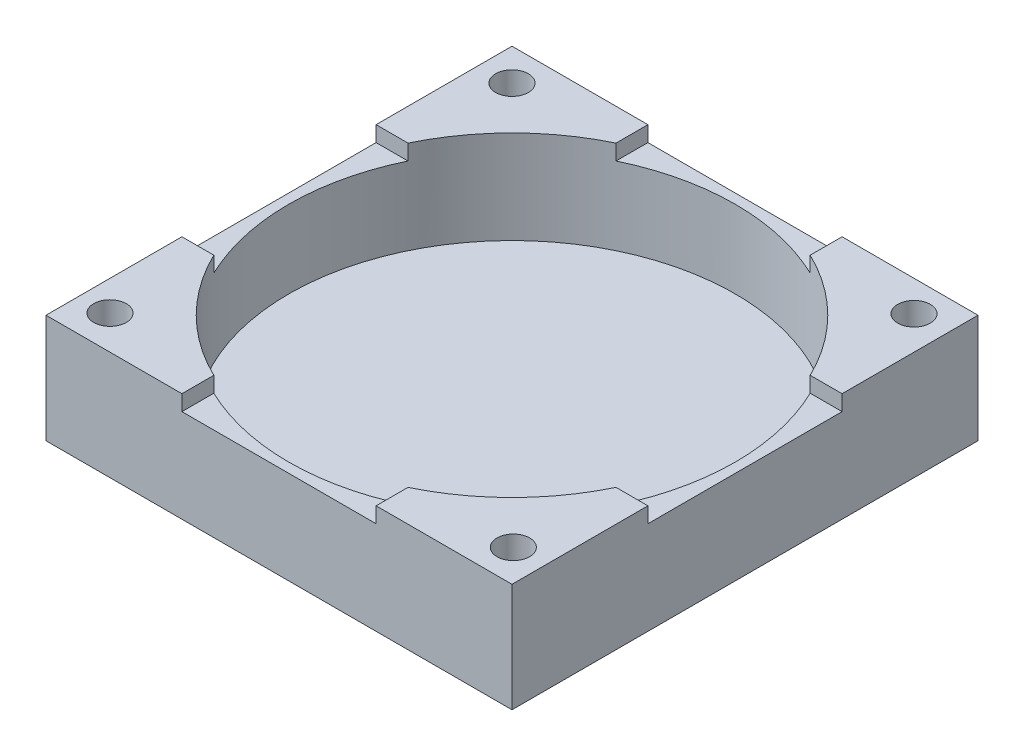
ISO-10303-21;
HEADER;
FILE_DESCRIPTION(('STEP AP214'),'2;1');
FILE_NAME('part.step','',(''),(''),'','','');
FILE_SCHEMA(('AUTOMOTIVE_DESIGN { 1 0 10303 214 1 1 1 1 }'));
ENDSEC;
DATA;
#1=APPLICATION_CONTEXT('core data for automotive mechanical design processes');
#2=APPLICATION_PROTOCOL_DEFINITION('international standard','automotive_design',2000,#1);
#3=PRODUCT_CONTEXT('',#1,'mechanical');
#4=PRODUCT('Part','Part','',(#3));
#5=PRODUCT_RELATED_PRODUCT_CATEGORY('part','',(#4));
#6=PRODUCT_DEFINITION_FORMATION('','',#4);
#7=PRODUCT_DEFINITION_CONTEXT('part definition',#1,'design');
#8=PRODUCT_DEFINITION('design','',#6,#7);
#9=PRODUCT_DEFINITION_SHAPE('','',#8);
#10=(LENGTH_UNIT() NAMED_UNIT(*) SI_UNIT(.MILLI.,.METRE.));
#11=(NAMED_UNIT(*) PLANE_ANGLE_UNIT() SI_UNIT($,.RADIAN.));
#12=(NAMED_UNIT(*) SI_UNIT($,.STERADIAN.) SOLID_ANGLE_UNIT());
#13=UNCERTAINTY_MEASURE_WITH_UNIT(LENGTH_MEASURE(1.E-05),#10,'distance_accuracy_value','');
#14=(GEOMETRIC_REPRESENTATION_CONTEXT(3) GLOBAL_UNCERTAINTY_ASSIGNED_CONTEXT((#13)) GLOBAL_UNIT_ASSIGNED_CONTEXT((#10,
#11,#12)) REPRESENTATION_CONTEXT('',''));
#15=CARTESIAN_POINT('',(0.,0.,0.));
#16=DIRECTION('',(0.,0.,1.));
#17=DIRECTION('',(1.,0.,0.));
#18=AXIS2_PLACEMENT_3D('',#15,#16,#17);
#19=CARTESIAN_POINT('',(0.,14.,0.));
#20=DIRECTION('',(0.,-1.,0.));
#21=DIRECTION('',(0.,0.,-1.));
#22=AXIS2_PLACEMENT_3D('',#19,#20,#21);
#23=PLANE('',#22);
#24=CARTESIAN_POINT('',(25.7137740717306,14.,-26.045380069947));
#25=DIRECTION('',(0.,1.,0.));
#26=DIRECTION('',(0.,0.,1.));
#27=AXIS2_PLACEMENT_3D('',#24,#25,#26);
#28=CIRCLE('',#27,2.1);
#29=CARTESIAN_POINT('',(25.7137740717306,14.,-23.945380069947));
#30=VERTEX_POINT('',#29);
#31=EDGE_CURVE('E327',#30,#30,#28,.T.);
#32=ORIENTED_EDGE('',*,*,#31,.F.);
#33=EDGE_LOOP('',(#32));
#34=FACE_BOUND('',#33,.T.);
#35=DIRECTION('',(0.,0.,1.));
#36=VECTOR('',#35,1.);
#37=CARTESIAN_POINT('',(12.5,14.,0.));
#38=LINE('',#37,#36);
#39=CARTESIAN_POINT('',(12.5,14.,-30.));
#40=VERTEX_POINT('',#39);
#41=CARTESIAN_POINT('',(12.5,14.,-25.89039397151));
#42=VERTEX_POINT('',#41);
#43=EDGE_CURVE('E185',#40,#42,#38,.T.);
#44=ORIENTED_EDGE('',*,*,#43,.T.);
#45=CARTESIAN_POINT('',(0.,14.,0.));
#46=DIRECTION('',(0.,1.,0.));
#47=DIRECTION('',(0.,0.,1.));
#48=AXIS2_PLACEMENT_3D('',#45,#46,#47);
#49=CIRCLE('',#48,28.75);
#50=CARTESIAN_POINT('',(25.89039397151,14.,-12.5));
#51=VERTEX_POINT('',#50);
#52=EDGE_CURVE('E364',#51,#42,#49,.T.);
#53=ORIENTED_EDGE('',*,*,#52,.F.);
#54=DIRECTION('',(-1.,0.,0.));
#55=VECTOR('',#54,1.);
#56=CARTESIAN_POINT('',(0.,14.,-12.5));
#57=LINE('',#56,#55);
#58=CARTESIAN_POINT('',(30.,14.,-12.5));
#59=VERTEX_POINT('',#58);
#60=EDGE_CURVE('E241',#59,#51,#57,.T.);
#61=ORIENTED_EDGE('',*,*,#60,.F.);
#62=DIRECTION('',(0.,0.,-1.));
#63=VECTOR('',#62,1.);
#64=CARTESIAN_POINT('',(30.,14.,30.));
#65=LINE('',#64,#63);
#66=CARTESIAN_POINT('',(30.,14.,-30.));
#67=VERTEX_POINT('',#66);
#68=EDGE_CURVE('E370',#59,#67,#65,.T.);
#69=ORIENTED_EDGE('',*,*,#68,.T.);
#70=DIRECTION('',(-1.,0.,0.));
#71=VECTOR('',#70,1.);
#72=CARTESIAN_POINT('',(-30.,14.,-30.));
#73=LINE('',#72,#71);
#74=EDGE_CURVE('E371',#67,#40,#73,.T.);
#75=ORIENTED_EDGE('',*,*,#74,.T.);
#76=EDGE_LOOP('',(#44,#53,#61,#69,#75));
#77=FACE_BOUND('',#76,.T.);
#78=ADVANCED_FACE('F41',(#34,#77),#23,.F.);
#79=CARTESIAN_POINT('',(-25.8801081914276,14.,-25.8801081914276));
#80=DIRECTION('',(0.,1.,0.));
#81=DIRECTION('',(0.,0.,1.));
#82=AXIS2_PLACEMENT_3D('',#79,#80,#81);
#83=CIRCLE('',#82,2.1);
#84=CARTESIAN_POINT('',(-25.8801081914276,14.,-23.7801081914276));
#85=VERTEX_POINT('',#84);
#86=EDGE_CURVE('E351',#85,#85,#83,.T.);
#87=ORIENTED_EDGE('',*,*,#86,.F.);
#88=EDGE_LOOP('',(#87));
#89=FACE_BOUND('',#88,.T.);
#90=CARTESIAN_POINT('',(-12.5,14.,-25.89039397151));
#91=VERTEX_POINT('',#90);
#92=CARTESIAN_POINT('',(-25.89039397151,14.,-12.5));
#93=VERTEX_POINT('',#92);
#94=EDGE_CURVE('E443',#91,#93,#49,.T.);
#95=ORIENTED_EDGE('',*,*,#94,.F.);
#96=DIRECTION('',(0.,0.,1.));
#97=VECTOR('',#96,1.);
#98=CARTESIAN_POINT('',(-12.5,14.,0.));
#99=LINE('',#98,#97);
#100=CARTESIAN_POINT('',(-12.5,14.,-30.));
#101=VERTEX_POINT('',#100);
#102=EDGE_CURVE('E200',#101,#91,#99,.T.);
#103=ORIENTED_EDGE('',*,*,#102,.F.);
#104=CARTESIAN_POINT('',(-30.,14.,-30.));
#105=VERTEX_POINT('',#104);
#106=EDGE_CURVE('E369',#101,#105,#73,.T.);
#107=ORIENTED_EDGE('',*,*,#106,.T.);
#108=DIRECTION('',(0.,0.,1.));
#109=VECTOR('',#108,1.);
#110=CARTESIAN_POINT('',(-30.,14.,30.));
#111=LINE('',#110,#109);
#112=CARTESIAN_POINT('',(-30.,14.,-12.5));
#113=VERTEX_POINT('',#112);
#114=EDGE_CURVE('E375',#105,#113,#111,.T.);
#115=ORIENTED_EDGE('',*,*,#114,.T.);
#116=DIRECTION('',(1.,0.,0.));
#117=VECTOR('',#116,1.);
#118=CARTESIAN_POINT('',(-30.,14.,-12.5));
#119=LINE('',#118,#117);
#120=EDGE_CURVE('E273',#113,#93,#119,.T.);
#121=ORIENTED_EDGE('',*,*,#120,.T.);
#122=EDGE_LOOP('',(#95,#103,#107,#115,#121));
#123=FACE_BOUND('',#122,.T.);
#124=ADVANCED_FACE('F463',(#89,#123),#23,.F.);
#125=CARTESIAN_POINT('',(-26.1207696675313,14.,25.6371876768061));
#126=DIRECTION('',(0.,1.,0.));
#127=DIRECTION('',(0.,0.,1.));
#128=AXIS2_PLACEMENT_3D('',#125,#126,#127);
#129=CIRCLE('',#128,2.1);
#130=CARTESIAN_POINT('',(-26.1207696675313,14.,27.7371876768061));
#131=VERTEX_POINT('',#130);
#132=EDGE_CURVE('E343',#131,#131,#129,.T.);
#133=ORIENTED_EDGE('',*,*,#132,.F.);
#134=EDGE_LOOP('',(#133));
#135=FACE_BOUND('',#134,.T.);
#136=DIRECTION('',(0.,0.,-1.));
#137=VECTOR('',#136,1.);
#138=CARTESIAN_POINT('',(-12.5,14.,0.));
#139=LINE('',#138,#137);
#140=CARTESIAN_POINT('',(-12.5,14.,30.));
#141=VERTEX_POINT('',#140);
#142=CARTESIAN_POINT('',(-12.5,14.,25.89039397151));
#143=VERTEX_POINT('',#142);
#144=EDGE_CURVE('E240',#141,#143,#139,.T.);
#145=ORIENTED_EDGE('',*,*,#144,.T.);
#146=CARTESIAN_POINT('',(-25.89039397151,14.,12.5));
#147=VERTEX_POINT('',#146);
#148=EDGE_CURVE('E355',#147,#143,#49,.T.);
#149=ORIENTED_EDGE('',*,*,#148,.F.);
#150=DIRECTION('',(1.,0.,0.));
#151=VECTOR('',#150,1.);
#152=CARTESIAN_POINT('',(-30.,14.,12.5));
#153=LINE('',#152,#151);
#154=CARTESIAN_POINT('',(-30.,14.,12.5));
#155=VERTEX_POINT('',#154);
#156=EDGE_CURVE('E308',#155,#147,#153,.T.);
#157=ORIENTED_EDGE('',*,*,#156,.F.);
#158=CARTESIAN_POINT('',(-30.,14.,30.));
#159=VERTEX_POINT('',#158);
#160=EDGE_CURVE('E374',#155,#159,#111,.T.);
#161=ORIENTED_EDGE('',*,*,#160,.T.);
#162=DIRECTION('',(1.,0.,0.));
#163=VECTOR('',#162,1.);
#164=CARTESIAN_POINT('',(-30.,14.,30.));
#165=LINE('',#164,#163);
#166=EDGE_CURVE('E380',#159,#141,#165,.T.);
#167=ORIENTED_EDGE('',*,*,#166,.T.);
#168=EDGE_LOOP('',(#145,#149,#157,#161,#167));
#169=FACE_BOUND('',#168,.T.);
#170=ADVANCED_FACE('F431',(#135,#169),#23,.F.);
#171=CARTESIAN_POINT('',(25.9643583400933,14.,25.7955828774469));
#172=DIRECTION('',(0.,1.,0.));
#173=DIRECTION('',(0.,0.,1.));
#174=AXIS2_PLACEMENT_3D('',#171,#172,#173);
#175=CIRCLE('',#174,2.1);
#176=CARTESIAN_POINT('',(25.9643583400933,14.,27.8955828774469));
#177=VERTEX_POINT('',#176);
#178=EDGE_CURVE('E335',#177,#177,#175,.T.);
#179=ORIENTED_EDGE('',*,*,#178,.F.);
#180=EDGE_LOOP('',(#179));
#181=FACE_BOUND('',#180,.T.);
#182=CARTESIAN_POINT('',(30.,14.,30.));
#183=VERTEX_POINT('',#182);
#184=CARTESIAN_POINT('',(30.,14.,12.5));
#185=VERTEX_POINT('',#184);
#186=EDGE_CURVE('E365',#183,#185,#65,.T.);
#187=ORIENTED_EDGE('',*,*,#186,.T.);
#188=DIRECTION('',(1.,0.,0.));
#189=VECTOR('',#188,1.);
#190=CARTESIAN_POINT('',(0.,14.,12.5));
#191=LINE('',#190,#189);
#192=CARTESIAN_POINT('',(25.89039397151,14.,12.5));
#193=VERTEX_POINT('',#192);
#194=EDGE_CURVE('E213',#193,#185,#191,.T.);
#195=ORIENTED_EDGE('',*,*,#194,.F.);
#196=CARTESIAN_POINT('',(12.5,14.,25.89039397151));
#197=VERTEX_POINT('',#196);
#198=EDGE_CURVE('E359',#197,#193,#49,.T.);
#199=ORIENTED_EDGE('',*,*,#198,.F.);
#200=DIRECTION('',(0.,0.,-1.));
#201=VECTOR('',#200,1.);
#202=CARTESIAN_POINT('',(12.5,14.,0.));
#203=LINE('',#202,#201);
#204=CARTESIAN_POINT('',(12.5,14.,30.));
#205=VERTEX_POINT('',#204);
#206=EDGE_CURVE('E274',#205,#197,#203,.T.);
#207=ORIENTED_EDGE('',*,*,#206,.F.);
#208=EDGE_CURVE('E379',#205,#183,#165,.T.);
#209=ORIENTED_EDGE('',*,*,#208,.T.);
#210=EDGE_LOOP('',(#187,#195,#199,#207,#209));
#211=FACE_BOUND('',#210,.T.);
#212=ADVANCED_FACE('F479',(#181,#211),#23,.F.);
#213=CARTESIAN_POINT('',(-30.,14.,-30.));
#214=DIRECTION('',(0.,0.,1.));
#215=DIRECTION('',(1.,0.,0.));
#216=AXIS2_PLACEMENT_3D('',#213,#214,#215);
#217=PLANE('',#216);
#218=DIRECTION('',(0.,1.,0.));
#219=VECTOR('',#218,1.);
#220=CARTESIAN_POINT('',(12.5,12.,-30.));
#221=LINE('',#220,#219);
#222=CARTESIAN_POINT('',(12.5,12.,-30.));
#223=VERTEX_POINT('',#222);
#224=EDGE_CURVE('E180',#223,#40,#221,.T.);
#225=ORIENTED_EDGE('',*,*,#224,.T.);
#226=ORIENTED_EDGE('',*,*,#74,.F.);
#227=DIRECTION('',(0.,-1.,0.));
#228=VECTOR('',#227,1.);
#229=CARTESIAN_POINT('',(30.,14.,-30.));
#230=LINE('',#229,#228);
#231=CARTESIAN_POINT('',(30.,0.,-30.));
#232=VERTEX_POINT('',#231);
#233=EDGE_CURVE('E50',#67,#232,#230,.T.);
#234=ORIENTED_EDGE('',*,*,#233,.T.);
#235=DIRECTION('',(-1.,0.,0.));
#236=VECTOR('',#235,1.);
#237=CARTESIAN_POINT('',(-30.,0.,-30.));
#238=LINE('',#237,#236);
#239=CARTESIAN_POINT('',(-30.,0.,-30.));
#240=VERTEX_POINT('',#239);
#241=EDGE_CURVE('E388',#232,#240,#238,.T.);
#242=ORIENTED_EDGE('',*,*,#241,.T.);
#243=DIRECTION('',(0.,-1.,0.));
#244=VECTOR('',#243,1.);
#245=CARTESIAN_POINT('',(-30.,14.,-30.));
#246=LINE('',#245,#244);
#247=EDGE_CURVE('E404',#105,#240,#246,.T.);
#248=ORIENTED_EDGE('',*,*,#247,.F.);
#249=ORIENTED_EDGE('',*,*,#106,.F.);
#250=DIRECTION('',(0.,1.,0.));
#251=VECTOR('',#250,1.);
#252=CARTESIAN_POINT('',(-12.5,12.,-30.));
#253=LINE('',#252,#251);
#254=CARTESIAN_POINT('',(-12.5,12.,-30.));
#255=VERTEX_POINT('',#254);
#256=EDGE_CURVE('E191',#255,#101,#253,.T.);
#257=ORIENTED_EDGE('',*,*,#256,.F.);
#258=DIRECTION('',(-1.,0.,0.));
#259=VECTOR('',#258,1.);
#260=CARTESIAN_POINT('',(0.,12.,-30.));
#261=LINE('',#260,#259);
#262=EDGE_CURVE('E195',#223,#255,#261,.T.);
#263=ORIENTED_EDGE('',*,*,#262,.F.);
#264=EDGE_LOOP('',(#225,#226,#234,#242,#248,#249,#257,#263));
#265=FACE_BOUND('',#264,.T.);
#266=ADVANCED_FACE('F202',(#265),#217,.F.);
#267=CARTESIAN_POINT('',(-30.,14.,30.));
#268=DIRECTION('',(1.,0.,0.));
#269=DIRECTION('',(0.,0.,-1.));
#270=AXIS2_PLACEMENT_3D('',#267,#268,#269);
#271=PLANE('',#270);
#272=DIRECTION('',(0.,1.,0.));
#273=VECTOR('',#272,1.);
#274=CARTESIAN_POINT('',(-30.,12.,-12.5));
#275=LINE('',#274,#273);
#276=CARTESIAN_POINT('',(-30.,12.,-12.5));
#277=VERTEX_POINT('',#276);
#278=EDGE_CURVE('E293',#277,#113,#275,.T.);
#279=ORIENTED_EDGE('',*,*,#278,.T.);
#280=ORIENTED_EDGE('',*,*,#114,.F.);
#281=ORIENTED_EDGE('',*,*,#247,.T.);
#282=DIRECTION('',(0.,0.,1.));
#283=VECTOR('',#282,1.);
#284=CARTESIAN_POINT('',(-30.,0.,30.));
#285=LINE('',#284,#283);
#286=CARTESIAN_POINT('',(-30.,0.,30.));
#287=VERTEX_POINT('',#286);
#288=EDGE_CURVE('E391',#240,#287,#285,.T.);
#289=ORIENTED_EDGE('',*,*,#288,.T.);
#290=DIRECTION('',(0.,-1.,0.));
#291=VECTOR('',#290,1.);
#292=CARTESIAN_POINT('',(-30.,14.,30.));
#293=LINE('',#292,#291);
#294=EDGE_CURVE('E400',#159,#287,#293,.T.);
#295=ORIENTED_EDGE('',*,*,#294,.F.);
#296=ORIENTED_EDGE('',*,*,#160,.F.);
#297=DIRECTION('',(0.,1.,0.));
#298=VECTOR('',#297,1.);
#299=CARTESIAN_POINT('',(-30.,12.,12.5));
#300=LINE('',#299,#298);
#301=CARTESIAN_POINT('',(-30.,12.,12.5));
#302=VERTEX_POINT('',#301);
#303=EDGE_CURVE('E304',#302,#155,#300,.T.);
#304=ORIENTED_EDGE('',*,*,#303,.F.);
#305=DIRECTION('',(0.,0.,-1.));
#306=VECTOR('',#305,1.);
#307=CARTESIAN_POINT('',(-30.,12.,12.5));
#308=LINE('',#307,#306);
#309=EDGE_CURVE('E311',#302,#277,#308,.T.);
#310=ORIENTED_EDGE('',*,*,#309,.T.);
#311=EDGE_LOOP('',(#279,#280,#281,#289,#295,#296,#304,#310));
#312=FACE_BOUND('',#311,.T.);
#313=ADVANCED_FACE('F423',(#312),#271,.F.);
#314=CARTESIAN_POINT('',(-30.,14.,30.));
#315=DIRECTION('',(0.,0.,-1.));
#316=DIRECTION('',(-1.,0.,0.));
#317=AXIS2_PLACEMENT_3D('',#314,#315,#316);
#318=PLANE('',#317);
#319=DIRECTION('',(0.,1.,0.));
#320=VECTOR('',#319,1.);
#321=CARTESIAN_POINT('',(-12.5,12.,30.));
#322=LINE('',#321,#320);
#323=CARTESIAN_POINT('',(-12.5,12.,30.));
#324=VERTEX_POINT('',#323);
#325=EDGE_CURVE('E258',#324,#141,#322,.T.);
#326=ORIENTED_EDGE('',*,*,#325,.T.);
#327=ORIENTED_EDGE('',*,*,#166,.F.);
#328=ORIENTED_EDGE('',*,*,#294,.T.);
#329=DIRECTION('',(1.,0.,0.));
#330=VECTOR('',#329,1.);
#331=CARTESIAN_POINT('',(-30.,0.,30.));
#332=LINE('',#331,#330);
#333=CARTESIAN_POINT('',(30.,0.,30.));
#334=VERTEX_POINT('',#333);
#335=EDGE_CURVE('E394',#287,#334,#332,.T.);
#336=ORIENTED_EDGE('',*,*,#335,.T.);
#337=DIRECTION('',(0.,-1.,0.));
#338=VECTOR('',#337,1.);
#339=CARTESIAN_POINT('',(30.,14.,30.));
#340=LINE('',#339,#338);
#341=EDGE_CURVE('E384',#183,#334,#340,.T.);
#342=ORIENTED_EDGE('',*,*,#341,.F.);
#343=ORIENTED_EDGE('',*,*,#208,.F.);
#344=DIRECTION('',(0.,1.,0.));
#345=VECTOR('',#344,1.);
#346=CARTESIAN_POINT('',(12.5,12.,30.));
#347=LINE('',#346,#345);
#348=CARTESIAN_POINT('',(12.5,12.,30.));
#349=VERTEX_POINT('',#348);
#350=EDGE_CURVE('E263',#349,#205,#347,.T.);
#351=ORIENTED_EDGE('',*,*,#350,.F.);
#352=DIRECTION('',(1.,0.,0.));
#353=VECTOR('',#352,1.);
#354=CARTESIAN_POINT('',(0.,12.,30.));
#355=LINE('',#354,#353);
#356=EDGE_CURVE('E287',#324,#349,#355,.T.);
#357=ORIENTED_EDGE('',*,*,#356,.F.);
#358=EDGE_LOOP('',(#326,#327,#328,#336,#342,#343,#351,#357));
#359=FACE_BOUND('',#358,.T.);
#360=ADVANCED_FACE('F428',(#359),#318,.F.);
#361=CARTESIAN_POINT('',(0.,14.,0.));
#362=DIRECTION('',(0.,-1.,0.));
#363=DIRECTION('',(0.,0.,-1.));
#364=AXIS2_PLACEMENT_3D('',#361,#362,#363);
#365=CYLINDRICAL_SURFACE('',#364,28.75);
#366=CARTESIAN_POINT('',(0.,2.,0.));
#367=DIRECTION('',(0.,1.,0.));
#368=DIRECTION('',(0.,0.,1.));
#369=AXIS2_PLACEMENT_3D('',#366,#367,#368);
#370=CIRCLE('',#369,28.75);
#371=CARTESIAN_POINT('',(0.,2.,28.75));
#372=VERTEX_POINT('',#371);
#373=EDGE_CURVE('E11',#372,#372,#370,.T.);
#374=ORIENTED_EDGE('',*,*,#373,.F.);
#375=EDGE_LOOP('',(#374));
#376=FACE_BOUND('',#375,.T.);
#377=ORIENTED_EDGE('',*,*,#52,.T.);
#378=DIRECTION('',(0.,1.,0.));
#379=VECTOR('',#378,1.);
#380=CARTESIAN_POINT('',(12.5,12.,-25.89039397151));
#381=LINE('',#380,#379);
#382=CARTESIAN_POINT('',(12.5,12.,-25.89039397151));
#383=VERTEX_POINT('',#382);
#384=EDGE_CURVE('E216',#383,#42,#381,.T.);
#385=ORIENTED_EDGE('',*,*,#384,.F.);
#386=CARTESIAN_POINT('',(0.,12.,0.));
#387=DIRECTION('',(0.,1.,0.));
#388=DIRECTION('',(0.,0.,1.));
#389=AXIS2_PLACEMENT_3D('',#386,#387,#388);
#390=CIRCLE('',#389,28.75);
#391=CARTESIAN_POINT('',(-12.5,12.,-25.89039397151));
#392=VERTEX_POINT('',#391);
#393=EDGE_CURVE('E192',#392,#383,#390,.F.);
#394=ORIENTED_EDGE('',*,*,#393,.F.);
#395=DIRECTION('',(0.,1.,0.));
#396=VECTOR('',#395,1.);
#397=CARTESIAN_POINT('',(-12.5,12.,-25.89039397151));
#398=LINE('',#397,#396);
#399=EDGE_CURVE('E220',#392,#91,#398,.T.);
#400=ORIENTED_EDGE('',*,*,#399,.T.);
#401=ORIENTED_EDGE('',*,*,#94,.T.);
#402=DIRECTION('',(0.,1.,0.));
#403=VECTOR('',#402,1.);
#404=CARTESIAN_POINT('',(-25.89039397151,12.,-12.5));
#405=LINE('',#404,#403);
#406=CARTESIAN_POINT('',(-25.89039397151,12.,-12.5));
#407=VERTEX_POINT('',#406);
#408=EDGE_CURVE('E297',#407,#93,#405,.T.);
#409=ORIENTED_EDGE('',*,*,#408,.F.);
#410=CARTESIAN_POINT('',(0.,12.,0.));
#411=DIRECTION('',(0.,1.,0.));
#412=DIRECTION('',(0.,0.,1.));
#413=AXIS2_PLACEMENT_3D('',#410,#411,#412);
#414=CIRCLE('',#413,28.75);
#415=CARTESIAN_POINT('',(-25.89039397151,12.,12.5));
#416=VERTEX_POINT('',#415);
#417=EDGE_CURVE('E317',#407,#416,#414,.T.);
#418=ORIENTED_EDGE('',*,*,#417,.T.);
#419=DIRECTION('',(0.,1.,0.));
#420=VECTOR('',#419,1.);
#421=CARTESIAN_POINT('',(-25.89039397151,12.,12.5));
#422=LINE('',#421,#420);
#423=EDGE_CURVE('E300',#416,#147,#422,.T.);
#424=ORIENTED_EDGE('',*,*,#423,.T.);
#425=ORIENTED_EDGE('',*,*,#148,.T.);
#426=DIRECTION('',(0.,1.,0.));
#427=VECTOR('',#426,1.);
#428=CARTESIAN_POINT('',(-12.5,12.,25.89039397151));
#429=LINE('',#428,#427);
#430=CARTESIAN_POINT('',(-12.5,12.,25.89039397151));
#431=VERTEX_POINT('',#430);
#432=EDGE_CURVE('E270',#431,#143,#429,.T.);
#433=ORIENTED_EDGE('',*,*,#432,.F.);
#434=CARTESIAN_POINT('',(0.,12.,0.));
#435=DIRECTION('',(0.,1.,0.));
#436=DIRECTION('',(0.,0.,1.));
#437=AXIS2_PLACEMENT_3D('',#434,#435,#436);
#438=CIRCLE('',#437,28.75);
#439=CARTESIAN_POINT('',(12.5,12.,25.89039397151));
#440=VERTEX_POINT('',#439);
#441=EDGE_CURVE('E262',#440,#431,#438,.F.);
#442=ORIENTED_EDGE('',*,*,#441,.F.);
#443=DIRECTION('',(0.,1.,0.));
#444=VECTOR('',#443,1.);
#445=CARTESIAN_POINT('',(12.5,12.,25.89039397151));
#446=LINE('',#445,#444);
#447=EDGE_CURVE('E266',#440,#197,#446,.T.);
#448=ORIENTED_EDGE('',*,*,#447,.T.);
#449=ORIENTED_EDGE('',*,*,#198,.T.);
#450=DIRECTION('',(0.,1.,0.));
#451=VECTOR('',#450,1.);
#452=CARTESIAN_POINT('',(25.89039397151,12.,12.5));
#453=LINE('',#452,#451);
#454=CARTESIAN_POINT('',(25.89039397151,12.,12.5));
#455=VERTEX_POINT('',#454);
#456=EDGE_CURVE('E226',#455,#193,#453,.T.);
#457=ORIENTED_EDGE('',*,*,#456,.F.);
#458=CARTESIAN_POINT('',(0.,12.,0.));
#459=DIRECTION('',(0.,1.,0.));
#460=DIRECTION('',(0.,0.,1.));
#461=AXIS2_PLACEMENT_3D('',#458,#459,#460);
#462=CIRCLE('',#461,28.75);
#463=CARTESIAN_POINT('',(25.89039397151,12.,-12.5));
#464=VERTEX_POINT('',#463);
#465=EDGE_CURVE('E244',#464,#455,#462,.F.);
#466=ORIENTED_EDGE('',*,*,#465,.F.);
#467=DIRECTION('',(0.,1.,0.));
#468=VECTOR('',#467,1.);
#469=CARTESIAN_POINT('',(25.89039397151,12.,-12.5));
#470=LINE('',#469,#468);
#471=EDGE_CURVE('E236',#464,#51,#470,.T.);
#472=ORIENTED_EDGE('',*,*,#471,.T.);
#473=EDGE_LOOP('',(#377,#385,#394,#400,#401,#409,#418,#424,#425,#433,#442,#448,#449,#457,#466,#472));
#474=FACE_BOUND('',#473,.T.);
#475=ADVANCED_FACE('F448',(#376,#474),#365,.F.);
#476=CARTESIAN_POINT('',(0.,0.,0.));
#477=DIRECTION('',(0.,-1.,0.));
#478=DIRECTION('',(0.,0.,-1.));
#479=AXIS2_PLACEMENT_3D('',#476,#477,#478);
#480=PLANE('',#479);
#481=CARTESIAN_POINT('',(25.9643583400933,0.,25.7955828774469));
#482=DIRECTION('',(0.,1.,0.));
#483=DIRECTION('',(0.,0.,1.));
#484=AXIS2_PLACEMENT_3D('',#481,#482,#483);
#485=CIRCLE('',#484,2.1);
#486=CARTESIAN_POINT('',(25.9643583400933,0.,27.8955828774469));
#487=VERTEX_POINT('',#486);
#488=EDGE_CURVE('E331',#487,#487,#485,.T.);
#489=ORIENTED_EDGE('',*,*,#488,.T.);
#490=EDGE_LOOP('',(#489));
#491=FACE_BOUND('',#490,.T.);
#492=CARTESIAN_POINT('',(-25.8801081914276,0.,-25.8801081914276));
#493=DIRECTION('',(0.,1.,0.));
#494=DIRECTION('',(0.,0.,1.));
#495=AXIS2_PLACEMENT_3D('',#492,#493,#494);
#496=CIRCLE('',#495,2.1);
#497=CARTESIAN_POINT('',(-25.8801081914276,0.,-23.7801081914276));
#498=VERTEX_POINT('',#497);
#499=EDGE_CURVE('E347',#498,#498,#496,.T.);
#500=ORIENTED_EDGE('',*,*,#499,.T.);
#501=EDGE_LOOP('',(#500));
#502=FACE_BOUND('',#501,.T.);
#503=DIRECTION('',(0.,0.,-1.));
#504=VECTOR('',#503,1.);
#505=CARTESIAN_POINT('',(30.,0.,30.));
#506=LINE('',#505,#504);
#507=EDGE_CURVE('E363',#334,#232,#506,.T.);
#508=ORIENTED_EDGE('',*,*,#507,.F.);
#509=ORIENTED_EDGE('',*,*,#335,.F.);
#510=ORIENTED_EDGE('',*,*,#288,.F.);
#511=ORIENTED_EDGE('',*,*,#241,.F.);
#512=EDGE_LOOP('',(#508,#509,#510,#511));
#513=FACE_BOUND('',#512,.T.);
#514=CARTESIAN_POINT('',(-26.1207696675313,0.,25.6371876768061));
#515=DIRECTION('',(0.,1.,0.));
#516=DIRECTION('',(0.,0.,1.));
#517=AXIS2_PLACEMENT_3D('',#514,#515,#516);
#518=CIRCLE('',#517,2.1);
#519=CARTESIAN_POINT('',(-26.1207696675313,0.,27.7371876768061));
#520=VERTEX_POINT('',#519);
#521=EDGE_CURVE('E339',#520,#520,#518,.T.);
#522=ORIENTED_EDGE('',*,*,#521,.T.);
#523=EDGE_LOOP('',(#522));
#524=FACE_BOUND('',#523,.T.);
#525=CARTESIAN_POINT('',(25.7137740717306,0.,-26.045380069947));
#526=DIRECTION('',(0.,1.,0.));
#527=DIRECTION('',(0.,0.,1.));
#528=AXIS2_PLACEMENT_3D('',#525,#526,#527);
#529=CIRCLE('',#528,2.1);
#530=CARTESIAN_POINT('',(25.7137740717306,0.,-23.945380069947));
#531=VERTEX_POINT('',#530);
#532=EDGE_CURVE('E219',#531,#531,#529,.T.);
#533=ORIENTED_EDGE('',*,*,#532,.T.);
#534=EDGE_LOOP('',(#533));
#535=FACE_BOUND('',#534,.T.);
#536=ADVANCED_FACE('F418',(#491,#502,#513,#524,#535),#480,.T.);
#537=CARTESIAN_POINT('',(30.,14.,30.));
#538=DIRECTION('',(-1.,0.,0.));
#539=DIRECTION('',(0.,0.,1.));
#540=AXIS2_PLACEMENT_3D('',#537,#538,#539);
#541=PLANE('',#540);
#542=ORIENTED_EDGE('',*,*,#68,.F.);
#543=DIRECTION('',(0.,1.,0.));
#544=VECTOR('',#543,1.);
#545=CARTESIAN_POINT('',(30.,12.,-12.5));
#546=LINE('',#545,#544);
#547=CARTESIAN_POINT('',(30.,12.,-12.5));
#548=VERTEX_POINT('',#547);
#549=EDGE_CURVE('E233',#548,#59,#546,.T.);
#550=ORIENTED_EDGE('',*,*,#549,.F.);
#551=DIRECTION('',(0.,0.,-1.));
#552=VECTOR('',#551,1.);
#553=CARTESIAN_POINT('',(30.,12.,0.));
#554=LINE('',#553,#552);
#555=CARTESIAN_POINT('',(30.,12.,12.5));
#556=VERTEX_POINT('',#555);
#557=EDGE_CURVE('E249',#556,#548,#554,.T.);
#558=ORIENTED_EDGE('',*,*,#557,.F.);
#559=DIRECTION('',(0.,1.,0.));
#560=VECTOR('',#559,1.);
#561=CARTESIAN_POINT('',(30.,12.,12.5));
#562=LINE('',#561,#560);
#563=EDGE_CURVE('E229',#556,#185,#562,.T.);
#564=ORIENTED_EDGE('',*,*,#563,.T.);
#565=ORIENTED_EDGE('',*,*,#186,.F.);
#566=ORIENTED_EDGE('',*,*,#341,.T.);
#567=ORIENTED_EDGE('',*,*,#507,.T.);
#568=ORIENTED_EDGE('',*,*,#233,.F.);
#569=EDGE_LOOP('',(#542,#550,#558,#564,#565,#566,#567,#568));
#570=FACE_BOUND('',#569,.T.);
#571=ADVANCED_FACE('F43',(#570),#541,.F.);
#572=CARTESIAN_POINT('',(-25.8801081914276,14.,-25.8801081914276));
#573=DIRECTION('',(0.,-1.,0.));
#574=DIRECTION('',(0.,0.,-1.));
#575=AXIS2_PLACEMENT_3D('',#572,#573,#574);
#576=CYLINDRICAL_SURFACE('',#575,2.1);
#577=ORIENTED_EDGE('',*,*,#86,.T.);
#578=EDGE_LOOP('',(#577));
#579=FACE_BOUND('',#578,.T.);
#580=ORIENTED_EDGE('',*,*,#499,.F.);
#581=EDGE_LOOP('',(#580));
#582=FACE_BOUND('',#581,.T.);
#583=ADVANCED_FACE('F549',(#579,#582),#576,.F.);
#584=CARTESIAN_POINT('',(-26.1207696675313,14.,25.6371876768061));
#585=DIRECTION('',(0.,-1.,0.));
#586=DIRECTION('',(0.,0.,-1.));
#587=AXIS2_PLACEMENT_3D('',#584,#585,#586);
#588=CYLINDRICAL_SURFACE('',#587,2.1);
#589=ORIENTED_EDGE('',*,*,#132,.T.);
#590=EDGE_LOOP('',(#589));
#591=FACE_BOUND('',#590,.T.);
#592=ORIENTED_EDGE('',*,*,#521,.F.);
#593=EDGE_LOOP('',(#592));
#594=FACE_BOUND('',#593,.T.);
#595=ADVANCED_FACE('F545',(#591,#594),#588,.F.);
#596=CARTESIAN_POINT('',(25.9643583400933,14.,25.7955828774469));
#597=DIRECTION('',(0.,-1.,0.));
#598=DIRECTION('',(0.,0.,-1.));
#599=AXIS2_PLACEMENT_3D('',#596,#597,#598);
#600=CYLINDRICAL_SURFACE('',#599,2.1);
#601=ORIENTED_EDGE('',*,*,#178,.T.);
#602=EDGE_LOOP('',(#601));
#603=FACE_BOUND('',#602,.T.);
#604=ORIENTED_EDGE('',*,*,#488,.F.);
#605=EDGE_LOOP('',(#604));
#606=FACE_BOUND('',#605,.T.);
#607=ADVANCED_FACE('F541',(#603,#606),#600,.F.);
#608=CARTESIAN_POINT('',(25.7137740717306,14.,-26.045380069947));
#609=DIRECTION('',(0.,-1.,0.));
#610=DIRECTION('',(0.,0.,-1.));
#611=AXIS2_PLACEMENT_3D('',#608,#609,#610);
#612=CYLINDRICAL_SURFACE('',#611,2.1);
#613=ORIENTED_EDGE('',*,*,#31,.T.);
#614=EDGE_LOOP('',(#613));
#615=FACE_BOUND('',#614,.T.);
#616=ORIENTED_EDGE('',*,*,#532,.F.);
#617=EDGE_LOOP('',(#616));
#618=FACE_BOUND('',#617,.T.);
#619=ADVANCED_FACE('F537',(#615,#618),#612,.F.);
#620=CARTESIAN_POINT('',(0.,2.,0.));
#621=DIRECTION('',(0.,1.,0.));
#622=DIRECTION('',(0.,0.,1.));
#623=AXIS2_PLACEMENT_3D('',#620,#621,#622);
#624=PLANE('',#623);
#625=ORIENTED_EDGE('',*,*,#373,.T.);
#626=EDGE_LOOP('',(#625));
#627=FACE_BOUND('',#626,.T.);
#628=ADVANCED_FACE('F532',(#627),#624,.T.);
#629=CARTESIAN_POINT('',(-30.,12.,-12.5));
#630=DIRECTION('',(0.,0.,1.));
#631=DIRECTION('',(1.,0.,0.));
#632=AXIS2_PLACEMENT_3D('',#629,#630,#631);
#633=PLANE('',#632);
#634=ORIENTED_EDGE('',*,*,#120,.F.);
#635=ORIENTED_EDGE('',*,*,#278,.F.);
#636=DIRECTION('',(1.,0.,0.));
#637=VECTOR('',#636,1.);
#638=CARTESIAN_POINT('',(-30.,12.,-12.5));
#639=LINE('',#638,#637);
#640=EDGE_CURVE('E321',#277,#407,#639,.T.);
#641=ORIENTED_EDGE('',*,*,#640,.T.);
#642=ORIENTED_EDGE('',*,*,#408,.T.);
#643=EDGE_LOOP('',(#634,#635,#641,#642));
#644=FACE_BOUND('',#643,.T.);
#645=ADVANCED_FACE('F460',(#644),#633,.T.);
#646=CARTESIAN_POINT('',(-30.,12.,12.5));
#647=DIRECTION('',(0.,0.,1.));
#648=DIRECTION('',(1.,0.,0.));
#649=AXIS2_PLACEMENT_3D('',#646,#647,#648);
#650=PLANE('',#649);
#651=ORIENTED_EDGE('',*,*,#156,.T.);
#652=ORIENTED_EDGE('',*,*,#423,.F.);
#653=DIRECTION('',(1.,0.,0.));
#654=VECTOR('',#653,1.);
#655=CARTESIAN_POINT('',(-30.,12.,12.5));
#656=LINE('',#655,#654);
#657=EDGE_CURVE('E307',#302,#416,#656,.T.);
#658=ORIENTED_EDGE('',*,*,#657,.F.);
#659=ORIENTED_EDGE('',*,*,#303,.T.);
#660=EDGE_LOOP('',(#651,#652,#658,#659));
#661=FACE_BOUND('',#660,.T.);
#662=ADVANCED_FACE('F455',(#661),#650,.F.);
#663=CARTESIAN_POINT('',(0.,12.,0.));
#664=DIRECTION('',(0.,1.,0.));
#665=DIRECTION('',(0.,0.,1.));
#666=AXIS2_PLACEMENT_3D('',#663,#664,#665);
#667=PLANE('',#666);
#668=ORIENTED_EDGE('',*,*,#309,.F.);
#669=ORIENTED_EDGE('',*,*,#657,.T.);
#670=ORIENTED_EDGE('',*,*,#417,.F.);
#671=ORIENTED_EDGE('',*,*,#640,.F.);
#672=EDGE_LOOP('',(#668,#669,#670,#671));
#673=FACE_BOUND('',#672,.T.);
#674=ADVANCED_FACE('F458',(#673),#667,.T.);
#675=CARTESIAN_POINT('',(-12.5,12.,0.));
#676=DIRECTION('',(1.,0.,0.));
#677=DIRECTION('',(0.,0.,-1.));
#678=AXIS2_PLACEMENT_3D('',#675,#676,#677);
#679=PLANE('',#678);
#680=ORIENTED_EDGE('',*,*,#144,.F.);
#681=ORIENTED_EDGE('',*,*,#325,.F.);
#682=DIRECTION('',(0.,0.,-1.));
#683=VECTOR('',#682,1.);
#684=CARTESIAN_POINT('',(-12.5,12.,0.));
#685=LINE('',#684,#683);
#686=EDGE_CURVE('E277',#324,#431,#685,.T.);
#687=ORIENTED_EDGE('',*,*,#686,.T.);
#688=ORIENTED_EDGE('',*,*,#432,.T.);
#689=EDGE_LOOP('',(#680,#681,#687,#688));
#690=FACE_BOUND('',#689,.T.);
#691=ADVANCED_FACE('F515',(#690),#679,.T.);
#692=CARTESIAN_POINT('',(12.5,12.,0.));
#693=DIRECTION('',(1.,0.,0.));
#694=DIRECTION('',(0.,0.,-1.));
#695=AXIS2_PLACEMENT_3D('',#692,#693,#694);
#696=PLANE('',#695);
#697=ORIENTED_EDGE('',*,*,#206,.T.);
#698=ORIENTED_EDGE('',*,*,#447,.F.);
#699=DIRECTION('',(0.,0.,-1.));
#700=VECTOR('',#699,1.);
#701=CARTESIAN_POINT('',(12.5,12.,0.));
#702=LINE('',#701,#700);
#703=EDGE_CURVE('E284',#349,#440,#702,.T.);
#704=ORIENTED_EDGE('',*,*,#703,.F.);
#705=ORIENTED_EDGE('',*,*,#350,.T.);
#706=EDGE_LOOP('',(#697,#698,#704,#705));
#707=FACE_BOUND('',#706,.T.);
#708=ADVANCED_FACE('F510',(#707),#696,.F.);
#709=CARTESIAN_POINT('',(0.,12.,0.));
#710=DIRECTION('',(0.,1.,0.));
#711=DIRECTION('',(0.,0.,1.));
#712=AXIS2_PLACEMENT_3D('',#709,#710,#711);
#713=PLANE('',#712);
#714=ORIENTED_EDGE('',*,*,#686,.F.);
#715=ORIENTED_EDGE('',*,*,#356,.T.);
#716=ORIENTED_EDGE('',*,*,#703,.T.);
#717=ORIENTED_EDGE('',*,*,#441,.T.);
#718=EDGE_LOOP('',(#714,#715,#716,#717));
#719=FACE_BOUND('',#718,.T.);
#720=ADVANCED_FACE('F513',(#719),#713,.T.);
#721=CARTESIAN_POINT('',(0.,12.,-12.5));
#722=DIRECTION('',(0.,0.,-1.));
#723=DIRECTION('',(-1.,0.,0.));
#724=AXIS2_PLACEMENT_3D('',#721,#722,#723);
#725=PLANE('',#724);
#726=ORIENTED_EDGE('',*,*,#60,.T.);
#727=ORIENTED_EDGE('',*,*,#471,.F.);
#728=DIRECTION('',(-1.,0.,0.));
#729=VECTOR('',#728,1.);
#730=CARTESIAN_POINT('',(0.,12.,-12.5));
#731=LINE('',#730,#729);
#732=EDGE_CURVE('E65',#548,#464,#731,.T.);
#733=ORIENTED_EDGE('',*,*,#732,.F.);
#734=ORIENTED_EDGE('',*,*,#549,.T.);
#735=EDGE_LOOP('',(#726,#727,#733,#734));
#736=FACE_BOUND('',#735,.T.);
#737=ADVANCED_FACE('F529',(#736),#725,.F.);
#738=CARTESIAN_POINT('',(0.,12.,12.5));
#739=DIRECTION('',(0.,0.,1.));
#740=DIRECTION('',(1.,0.,0.));
#741=AXIS2_PLACEMENT_3D('',#738,#739,#740);
#742=PLANE('',#741);
#743=ORIENTED_EDGE('',*,*,#194,.T.);
#744=ORIENTED_EDGE('',*,*,#563,.F.);
#745=DIRECTION('',(1.,0.,0.));
#746=VECTOR('',#745,1.);
#747=CARTESIAN_POINT('',(0.,12.,12.5));
#748=LINE('',#747,#746);
#749=EDGE_CURVE('E252',#455,#556,#748,.T.);
#750=ORIENTED_EDGE('',*,*,#749,.F.);
#751=ORIENTED_EDGE('',*,*,#456,.T.);
#752=EDGE_LOOP('',(#743,#744,#750,#751));
#753=FACE_BOUND('',#752,.T.);
#754=ADVANCED_FACE('F504',(#753),#742,.F.);
#755=CARTESIAN_POINT('',(0.,12.,0.));
#756=DIRECTION('',(0.,1.,0.));
#757=DIRECTION('',(0.,0.,1.));
#758=AXIS2_PLACEMENT_3D('',#755,#756,#757);
#759=PLANE('',#758);
#760=ORIENTED_EDGE('',*,*,#465,.T.);
#761=ORIENTED_EDGE('',*,*,#749,.T.);
#762=ORIENTED_EDGE('',*,*,#557,.T.);
#763=ORIENTED_EDGE('',*,*,#732,.T.);
#764=EDGE_LOOP('',(#760,#761,#762,#763));
#765=FACE_BOUND('',#764,.T.);
#766=ADVANCED_FACE('F474',(#765),#759,.T.);
#767=CARTESIAN_POINT('',(12.5,12.,0.));
#768=DIRECTION('',(-1.,0.,0.));
#769=DIRECTION('',(0.,0.,1.));
#770=AXIS2_PLACEMENT_3D('',#767,#768,#769);
#771=PLANE('',#770);
#772=ORIENTED_EDGE('',*,*,#43,.F.);
#773=ORIENTED_EDGE('',*,*,#224,.F.);
#774=DIRECTION('',(0.,0.,1.));
#775=VECTOR('',#774,1.);
#776=CARTESIAN_POINT('',(12.5,12.,0.));
#777=LINE('',#776,#775);
#778=EDGE_CURVE('E183',#223,#383,#777,.T.);
#779=ORIENTED_EDGE('',*,*,#778,.T.);
#780=ORIENTED_EDGE('',*,*,#384,.T.);
#781=EDGE_LOOP('',(#772,#773,#779,#780));
#782=FACE_BOUND('',#781,.T.);
#783=ADVANCED_FACE('F182',(#782),#771,.T.);
#784=CARTESIAN_POINT('',(-12.5,12.,0.));
#785=DIRECTION('',(-1.,0.,0.));
#786=DIRECTION('',(0.,0.,1.));
#787=AXIS2_PLACEMENT_3D('',#784,#785,#786);
#788=PLANE('',#787);
#789=ORIENTED_EDGE('',*,*,#102,.T.);
#790=ORIENTED_EDGE('',*,*,#399,.F.);
#791=DIRECTION('',(0.,0.,1.));
#792=VECTOR('',#791,1.);
#793=CARTESIAN_POINT('',(-12.5,12.,0.));
#794=LINE('',#793,#792);
#795=EDGE_CURVE('E57',#255,#392,#794,.T.);
#796=ORIENTED_EDGE('',*,*,#795,.F.);
#797=ORIENTED_EDGE('',*,*,#256,.T.);
#798=EDGE_LOOP('',(#789,#790,#796,#797));
#799=FACE_BOUND('',#798,.T.);
#800=ADVANCED_FACE('F466',(#799),#788,.F.);
#801=CARTESIAN_POINT('',(0.,12.,0.));
#802=DIRECTION('',(0.,1.,0.));
#803=DIRECTION('',(0.,0.,1.));
#804=AXIS2_PLACEMENT_3D('',#801,#802,#803);
#805=PLANE('',#804);
#806=ORIENTED_EDGE('',*,*,#778,.F.);
#807=ORIENTED_EDGE('',*,*,#262,.T.);
#808=ORIENTED_EDGE('',*,*,#795,.T.);
#809=ORIENTED_EDGE('',*,*,#393,.T.);
#810=EDGE_LOOP('',(#806,#807,#808,#809));
#811=FACE_BOUND('',#810,.T.);
#812=ADVANCED_FACE('F194',(#811),#805,.T.);
#813=CLOSED_SHELL('',(#78,#124,#170,#212,#266,#313,#360,#475,#536,#571,#583,#595,#607,#619,#628,
#645,#662,#674,#691,#708,#720,#737,#754,#766,#783,#800,#812));
#814=MANIFOLD_SOLID_BREP('B2',#813);
#815=ADVANCED_BREP_SHAPE_REPRESENTATION('',(#18,#814),#14);
#816=SHAPE_DEFINITION_REPRESENTATION(#9,#815);
ENDSEC;
END-ISO-10303-21;
